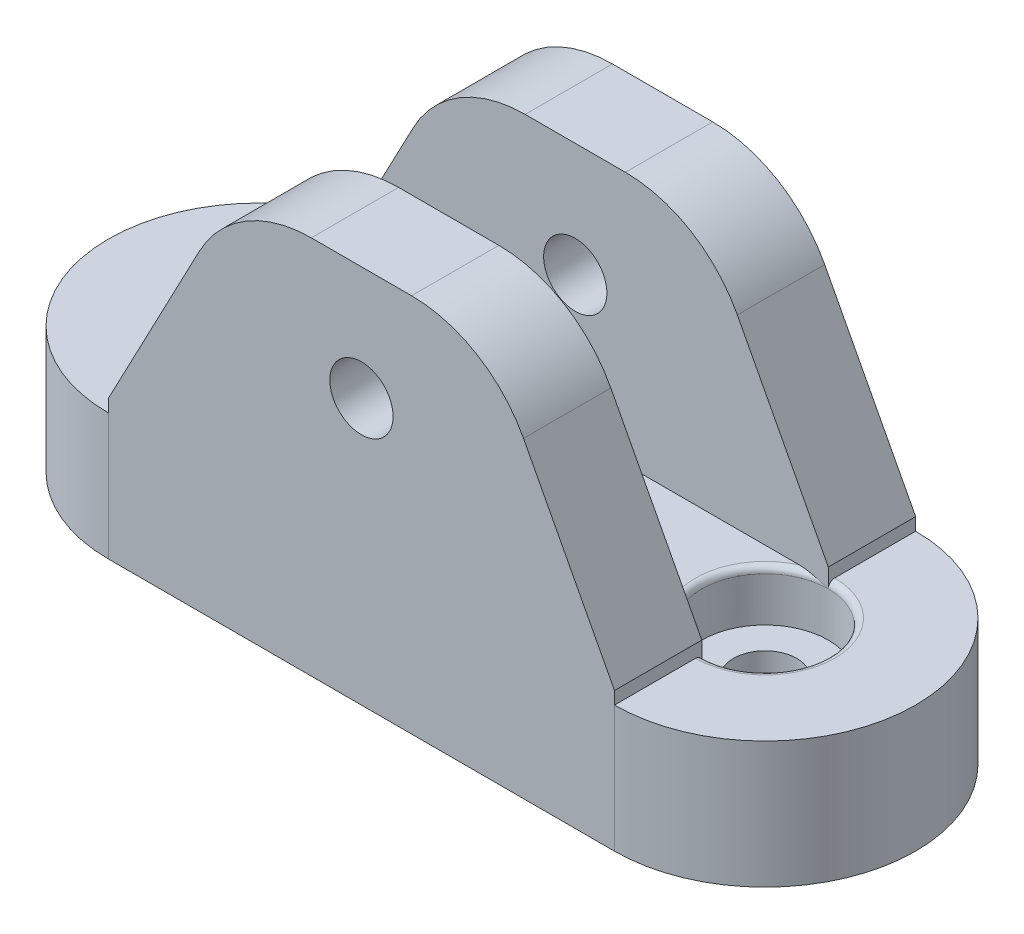
ISO-10303-21;
HEADER;
FILE_DESCRIPTION(('STEP AP214'),'2;1');
FILE_NAME('part.step','',(''),(''),'','','');
FILE_SCHEMA(('AUTOMOTIVE_DESIGN { 1 0 10303 214 1 1 1 1 }'));
ENDSEC;
DATA;
#1=APPLICATION_CONTEXT('core data for automotive mechanical design processes');
#2=APPLICATION_PROTOCOL_DEFINITION('international standard','automotive_design',2000,#1);
#3=PRODUCT_CONTEXT('',#1,'mechanical');
#4=PRODUCT('Part','Part','',(#3));
#5=PRODUCT_RELATED_PRODUCT_CATEGORY('part','',(#4));
#6=PRODUCT_DEFINITION_FORMATION('','',#4);
#7=PRODUCT_DEFINITION_CONTEXT('part definition',#1,'design');
#8=PRODUCT_DEFINITION('design','',#6,#7);
#9=PRODUCT_DEFINITION_SHAPE('','',#8);
#10=(LENGTH_UNIT() NAMED_UNIT(*) SI_UNIT(.MILLI.,.METRE.));
#11=(NAMED_UNIT(*) PLANE_ANGLE_UNIT() SI_UNIT($,.RADIAN.));
#12=(NAMED_UNIT(*) SI_UNIT($,.STERADIAN.) SOLID_ANGLE_UNIT());
#13=UNCERTAINTY_MEASURE_WITH_UNIT(LENGTH_MEASURE(1.E-05),#10,'distance_accuracy_value','');
#14=(GEOMETRIC_REPRESENTATION_CONTEXT(3) GLOBAL_UNCERTAINTY_ASSIGNED_CONTEXT((#13)) GLOBAL_UNIT_ASSIGNED_CONTEXT((#10,
#11,#12)) REPRESENTATION_CONTEXT('',''));
#15=CARTESIAN_POINT('',(0.,0.,0.));
#16=DIRECTION('',(0.,0.,1.));
#17=DIRECTION('',(1.,0.,0.));
#18=AXIS2_PLACEMENT_3D('',#15,#16,#17);
#19=CARTESIAN_POINT('',(-40.,9.5,0.));
#20=DIRECTION('',(0.,1.,0.));
#21=DIRECTION('',(0.,0.,1.));
#22=AXIS2_PLACEMENT_3D('',#19,#20,#21);
#23=TOROIDAL_SURFACE('',#22,5.5,0.5);
#24=CARTESIAN_POINT('',(-40.,9.5,5.5));
#25=DIRECTION('',(-1.,0.,0.));
#26=DIRECTION('',(0.,0.,1.));
#27=AXIS2_PLACEMENT_3D('',#24,#25,#26);
#28=CIRCLE('',#27,0.5);
#29=CARTESIAN_POINT('',(-40.,9.50000261258141,5.));
#30=VERTEX_POINT('',#29);
#31=CARTESIAN_POINT('',(-40.,10.,5.5));
#32=VERTEX_POINT('',#31);
#33=EDGE_CURVE('E114',#30,#32,#28,.F.);
#34=ORIENTED_EDGE('',*,*,#33,.F.);
#35=CARTESIAN_POINT('',(-40.,9.5,0.));
#36=DIRECTION('',(0.,1.,0.));
#37=DIRECTION('',(0.,0.,1.));
#38=AXIS2_PLACEMENT_3D('',#35,#36,#37);
#39=CIRCLE('',#38,5.);
#40=CARTESIAN_POINT('',(-40.,9.50000261332683,-5.));
#41=VERTEX_POINT('',#40);
#42=EDGE_CURVE('E511',#41,#30,#39,.T.);
#43=ORIENTED_EDGE('',*,*,#42,.F.);
#44=CARTESIAN_POINT('',(-40.,9.5,-5.49999999999999));
#45=DIRECTION('',(-1.,0.,0.));
#46=DIRECTION('',(0.,0.,1.));
#47=AXIS2_PLACEMENT_3D('',#44,#45,#46);
#48=CIRCLE('',#47,0.5);
#49=CARTESIAN_POINT('',(-40.,10.,-5.49999999999999));
#50=VERTEX_POINT('',#49);
#51=EDGE_CURVE('E12',#50,#41,#48,.F.);
#52=ORIENTED_EDGE('',*,*,#51,.F.);
#53=CARTESIAN_POINT('',(-40.,10.,0.));
#54=DIRECTION('',(0.,1.,0.));
#55=DIRECTION('',(0.,0.,1.));
#56=AXIS2_PLACEMENT_3D('',#53,#54,#55);
#57=CIRCLE('',#56,5.5);
#58=EDGE_CURVE('E524',#32,#50,#57,.F.);
#59=ORIENTED_EDGE('',*,*,#58,.F.);
#60=EDGE_LOOP('',(#34,#43,#52,#59));
#61=FACE_BOUND('',#60,.T.);
#62=ADVANCED_FACE('F104',(#61),#23,.T.);
#63=CARTESIAN_POINT('',(0.,9.5,0.));
#64=DIRECTION('',(0.,1.,0.));
#65=DIRECTION('',(0.,0.,1.));
#66=AXIS2_PLACEMENT_3D('',#63,#64,#65);
#67=TOROIDAL_SURFACE('',#66,5.5,0.5);
#68=CARTESIAN_POINT('',(-2.29128784747791,10.,5.));
#69=CARTESIAN_POINT('',(-2.2490483743288,9.99999410904903,5.));
#70=CARTESIAN_POINT('',(-2.20681979969826,9.9990718362252,5.));
#71=CARTESIAN_POINT('',(-2.12244384316885,9.99559960665418,5.));
#72=CARTESIAN_POINT('',(-2.08029643715897,9.99305024742337,5.));
#73=CARTESIAN_POINT('',(-1.95415157812684,9.9832781161519,5.));
#74=CARTESIAN_POINT('',(-1.87031771096238,9.97392997135818,5.));
#75=CARTESIAN_POINT('',(-1.70358415770108,9.95083147326194,5.));
#76=CARTESIAN_POINT('',(-1.62068223483208,9.93709656666971,5.));
#77=CARTESIAN_POINT('',(-1.45551091644458,9.90613848742699,5.));
#78=CARTESIAN_POINT('',(-1.37324175258213,9.88891409498158,5.));
#79=CARTESIAN_POINT('',(-1.2243526500402,9.85513702582717,5.));
#80=CARTESIAN_POINT('',(-1.15762775147923,9.8390397070518,5.));
#81=CARTESIAN_POINT('',(-0.929403539405844,9.78131038986787,5.));
#82=CARTESIAN_POINT('',(-0.768819442296111,9.73608054179532,5.));
#83=CARTESIAN_POINT('',(-0.448992904347548,9.64114954774573,5.));
#84=CARTESIAN_POINT('',(-0.289750807280321,9.59144729202464,5.));
#85=CARTESIAN_POINT('',(-0.0915925992896696,9.52895998544529,5.));
#86=CARTESIAN_POINT('',(-0.0525378271088201,9.51661349275646,5.));
#87=CARTESIAN_POINT('',(-0.00898933106001763,9.50284267768611,5.));
#88=CARTESIAN_POINT('',(-0.00449466526113658,9.50142133973301,5.));
#89=CARTESIAN_POINT('',(0.,9.5,5.));
#90=B_SPLINE_CURVE_WITH_KNOTS('',3,(#68,#69,#70,#71,#72,#73,#74,#75,#76,#77,#78,#79,#80,#81,#82,
#83,#84,#85,#86,#87,#88,#89),.UNSPECIFIED.,.F.,.F.,(4,2,2,2,2,2,2,2,2,2,4),(0.,
0.126691793541781,0.253337088693143,0.506227274035632,0.758236619482897,1.01033421053244,
1.21623290454849,1.71656005335375,2.21701169310375,2.33989131447064,2.35403345009444),.UNSPECIFIED.);
#91=CARTESIAN_POINT('',(0.,9.50000261308246,5.));
#92=VERTEX_POINT('',#91);
#93=CARTESIAN_POINT('',(-2.29128784747791,10.,5.));
#94=VERTEX_POINT('',#93);
#95=EDGE_CURVE('E128',#92,#94,#90,.F.);
#96=ORIENTED_EDGE('',*,*,#95,.F.);
#97=CARTESIAN_POINT('',(0.,9.5,0.));
#98=DIRECTION('',(0.,1.,0.));
#99=DIRECTION('',(0.,0.,1.));
#100=AXIS2_PLACEMENT_3D('',#97,#98,#99);
#101=CIRCLE('',#100,5.);
#102=CARTESIAN_POINT('',(0.,9.50000174205497,-5.));
#103=VERTEX_POINT('',#102);
#104=EDGE_CURVE('E493',#103,#92,#101,.T.);
#105=ORIENTED_EDGE('',*,*,#104,.F.);
#106=CARTESIAN_POINT('',(-2.29128784747791,10.,-5.));
#107=CARTESIAN_POINT('',(-2.2490483743288,9.99999410904903,-5.));
#108=CARTESIAN_POINT('',(-2.20681979969826,9.9990718362252,-5.));
#109=CARTESIAN_POINT('',(-2.12244384316885,9.99559960665418,-5.));
#110=CARTESIAN_POINT('',(-2.08029643715897,9.99305024742337,-5.));
#111=CARTESIAN_POINT('',(-1.95415157812684,9.9832781161519,-5.));
#112=CARTESIAN_POINT('',(-1.87031771096238,9.97392997135818,-5.));
#113=CARTESIAN_POINT('',(-1.70358415770108,9.95083147326194,-5.));
#114=CARTESIAN_POINT('',(-1.62068223483208,9.93709656666971,-5.));
#115=CARTESIAN_POINT('',(-1.45551091644458,9.90613848742699,-5.));
#116=CARTESIAN_POINT('',(-1.37324175258213,9.88891409498158,-5.));
#117=CARTESIAN_POINT('',(-1.2243526500402,9.85513702582717,-5.));
#118=CARTESIAN_POINT('',(-1.15762775147923,9.8390397070518,-5.));
#119=CARTESIAN_POINT('',(-0.929403539405845,9.78131038986787,-5.));
#120=CARTESIAN_POINT('',(-0.768819442296111,9.73608054179532,-5.));
#121=CARTESIAN_POINT('',(-0.448992904347548,9.64114954774573,-5.));
#122=CARTESIAN_POINT('',(-0.289750807280322,9.59144729202464,-4.99999999999999));
#123=CARTESIAN_POINT('',(-0.0915925992896701,9.52895998544529,-5.));
#124=CARTESIAN_POINT('',(-0.0525378271088203,9.51661349275646,-5.));
#125=CARTESIAN_POINT('',(-0.00898933106001771,9.50284267768611,-5.));
#126=CARTESIAN_POINT('',(-0.00449466526113663,9.50142133973301,-5.));
#127=CARTESIAN_POINT('',(0.,9.5,-5.));
#128=B_SPLINE_CURVE_WITH_KNOTS('',3,(#106,#107,#108,#109,#110,#111,#112,#113,#114,#115,#116,
#117,#118,#119,#120,#121,#122,#123,#124,#125,#126,#127),.UNSPECIFIED.,.F.,.F.,(4,2,2,2,2,2,2,2,
2,2,4),(0.,0.126691793541781,0.253337088693143,0.506227274035632,0.758236619482896,
1.01033421053244,1.21623290454848,1.71656005335375,2.21701169310375,2.33989131447064,
2.35403345009444),.UNSPECIFIED.);
#129=CARTESIAN_POINT('',(-2.29128784747791,10.,-5.));
#130=VERTEX_POINT('',#129);
#131=EDGE_CURVE('E527',#130,#103,#128,.T.);
#132=ORIENTED_EDGE('',*,*,#131,.F.);
#133=CARTESIAN_POINT('',(0.,10.,0.));
#134=DIRECTION('',(0.,1.,0.));
#135=DIRECTION('',(0.,0.,1.));
#136=AXIS2_PLACEMENT_3D('',#133,#134,#135);
#137=CIRCLE('',#136,5.5);
#138=EDGE_CURVE('E516',#94,#130,#137,.F.);
#139=ORIENTED_EDGE('',*,*,#138,.F.);
#140=EDGE_LOOP('',(#96,#105,#132,#139));
#141=FACE_BOUND('',#140,.T.);
#142=ADVANCED_FACE('F643',(#141),#67,.T.);
#143=CARTESIAN_POINT('',(0.,10.,0.));
#144=DIRECTION('',(0.,1.,0.));
#145=DIRECTION('',(0.,0.,1.));
#146=AXIS2_PLACEMENT_3D('',#143,#144,#145);
#147=PLANE('',#146);
#148=DIRECTION('',(1.,0.,0.));
#149=VECTOR('',#148,1.);
#150=CARTESIAN_POINT('',(0.,10.,-5.));
#151=LINE('',#150,#149);
#152=CARTESIAN_POINT('',(-37.7087121525221,10.,-5.));
#153=VERTEX_POINT('',#152);
#154=EDGE_CURVE('E351',#153,#130,#151,.T.);
#155=ORIENTED_EDGE('',*,*,#154,.F.);
#156=CARTESIAN_POINT('',(-40.,10.,0.));
#157=DIRECTION('',(0.,1.,0.));
#158=DIRECTION('',(0.,0.,1.));
#159=AXIS2_PLACEMENT_3D('',#156,#157,#158);
#160=CIRCLE('',#159,5.5);
#161=CARTESIAN_POINT('',(-37.7087121525221,10.,5.));
#162=VERTEX_POINT('',#161);
#163=EDGE_CURVE('E520',#153,#162,#160,.F.);
#164=ORIENTED_EDGE('',*,*,#163,.T.);
#165=DIRECTION('',(1.,0.,0.));
#166=VECTOR('',#165,1.);
#167=CARTESIAN_POINT('',(0.,10.,5.));
#168=LINE('',#167,#166);
#169=EDGE_CURVE('E444',#162,#94,#168,.T.);
#170=ORIENTED_EDGE('',*,*,#169,.T.);
#171=ORIENTED_EDGE('',*,*,#138,.T.);
#172=EDGE_LOOP('',(#155,#164,#170,#171));
#173=FACE_BOUND('',#172,.T.);
#174=ADVANCED_FACE('F625',(#173),#147,.T.);
#175=DIRECTION('',(0.,0.,-1.));
#176=VECTOR('',#175,1.);
#177=CARTESIAN_POINT('',(0.,10.,0.));
#178=LINE('',#177,#176);
#179=CARTESIAN_POINT('',(0.,10.,-5.5));
#180=VERTEX_POINT('',#179);
#181=CARTESIAN_POINT('',(0.,10.,-11.9));
#182=VERTEX_POINT('',#181);
#183=EDGE_CURVE('E348',#180,#182,#178,.T.);
#184=ORIENTED_EDGE('',*,*,#183,.F.);
#185=CARTESIAN_POINT('',(0.,10.,0.));
#186=DIRECTION('',(0.,1.,0.));
#187=DIRECTION('',(0.,0.,1.));
#188=AXIS2_PLACEMENT_3D('',#185,#186,#187);
#189=CIRCLE('',#188,5.5);
#190=CARTESIAN_POINT('',(0.,10.,5.5));
#191=VERTEX_POINT('',#190);
#192=EDGE_CURVE('E507',#180,#191,#189,.F.);
#193=ORIENTED_EDGE('',*,*,#192,.T.);
#194=DIRECTION('',(0.,0.,-1.));
#195=VECTOR('',#194,1.);
#196=CARTESIAN_POINT('',(0.,10.,0.));
#197=LINE('',#196,#195);
#198=CARTESIAN_POINT('',(0.,10.,11.9));
#199=VERTEX_POINT('',#198);
#200=EDGE_CURVE('E440',#199,#191,#197,.T.);
#201=ORIENTED_EDGE('',*,*,#200,.F.);
#202=CARTESIAN_POINT('',(0.,10.,0.));
#203=DIRECTION('',(0.,1.,0.));
#204=DIRECTION('',(0.,0.,1.));
#205=AXIS2_PLACEMENT_3D('',#202,#203,#204);
#206=CIRCLE('',#205,11.9);
#207=EDGE_CURVE('E457',#199,#182,#206,.T.);
#208=ORIENTED_EDGE('',*,*,#207,.T.);
#209=EDGE_LOOP('',(#184,#193,#201,#208));
#210=FACE_BOUND('',#209,.T.);
#211=ADVANCED_FACE('F619',(#210),#147,.T.);
#212=CARTESIAN_POINT('',(-40.,10.,0.));
#213=DIRECTION('',(0.,-1.,0.));
#214=DIRECTION('',(0.,0.,-1.));
#215=AXIS2_PLACEMENT_3D('',#212,#213,#214);
#216=CYLINDRICAL_SURFACE('',#215,2.49999999999999);
#217=CARTESIAN_POINT('',(-40.,0.,0.));
#218=DIRECTION('',(0.,1.,0.));
#219=DIRECTION('',(0.,0.,1.));
#220=AXIS2_PLACEMENT_3D('',#217,#218,#219);
#221=CIRCLE('',#220,2.49999999999999);
#222=CARTESIAN_POINT('',(-40.,0.,2.5));
#223=VERTEX_POINT('',#222);
#224=EDGE_CURVE('E452',#223,#223,#221,.T.);
#225=ORIENTED_EDGE('',*,*,#224,.F.);
#226=EDGE_LOOP('',(#225));
#227=FACE_BOUND('',#226,.T.);
#228=CARTESIAN_POINT('',(-40.,6.,0.));
#229=DIRECTION('',(0.,1.,0.));
#230=DIRECTION('',(0.,0.,1.));
#231=AXIS2_PLACEMENT_3D('',#228,#229,#230);
#232=CIRCLE('',#231,2.49999999999999);
#233=CARTESIAN_POINT('',(-40.,6.,2.5));
#234=VERTEX_POINT('',#233);
#235=EDGE_CURVE('E498',#234,#234,#232,.T.);
#236=ORIENTED_EDGE('',*,*,#235,.T.);
#237=EDGE_LOOP('',(#236));
#238=FACE_BOUND('',#237,.T.);
#239=ADVANCED_FACE('F615',(#227,#238),#216,.F.);
#240=DIRECTION('',(0.,0.,1.));
#241=VECTOR('',#240,1.);
#242=CARTESIAN_POINT('',(-40.,10.,0.));
#243=LINE('',#242,#241);
#244=CARTESIAN_POINT('',(-40.,10.,11.9));
#245=VERTEX_POINT('',#244);
#246=EDGE_CURVE('E421',#32,#245,#243,.T.);
#247=ORIENTED_EDGE('',*,*,#246,.F.);
#248=ORIENTED_EDGE('',*,*,#58,.T.);
#249=DIRECTION('',(0.,0.,1.));
#250=VECTOR('',#249,1.);
#251=CARTESIAN_POINT('',(-40.,10.,0.));
#252=LINE('',#251,#250);
#253=CARTESIAN_POINT('',(-40.,10.,-11.9));
#254=VERTEX_POINT('',#253);
#255=EDGE_CURVE('E331',#254,#50,#252,.T.);
#256=ORIENTED_EDGE('',*,*,#255,.F.);
#257=CARTESIAN_POINT('',(-40.,10.,0.));
#258=DIRECTION('',(0.,1.,0.));
#259=DIRECTION('',(0.,0.,1.));
#260=AXIS2_PLACEMENT_3D('',#257,#258,#259);
#261=CIRCLE('',#260,11.9);
#262=EDGE_CURVE('E461',#254,#245,#261,.T.);
#263=ORIENTED_EDGE('',*,*,#262,.T.);
#264=EDGE_LOOP('',(#247,#248,#256,#263));
#265=FACE_BOUND('',#264,.T.);
#266=ADVANCED_FACE('F618',(#265),#147,.T.);
#267=CARTESIAN_POINT('',(0.,0.,0.));
#268=DIRECTION('',(0.,1.,0.));
#269=DIRECTION('',(0.,0.,1.));
#270=AXIS2_PLACEMENT_3D('',#267,#268,#269);
#271=PLANE('',#270);
#272=DIRECTION('',(-1.,0.,0.));
#273=VECTOR('',#272,1.);
#274=CARTESIAN_POINT('',(0.,0.,-11.9));
#275=LINE('',#274,#273);
#276=CARTESIAN_POINT('',(0.,0.,-11.9));
#277=VERTEX_POINT('',#276);
#278=CARTESIAN_POINT('',(-40.,0.,-11.9));
#279=VERTEX_POINT('',#278);
#280=EDGE_CURVE('E470',#277,#279,#275,.T.);
#281=ORIENTED_EDGE('',*,*,#280,.F.);
#282=CARTESIAN_POINT('',(0.,0.,0.));
#283=DIRECTION('',(0.,1.,0.));
#284=DIRECTION('',(0.,0.,1.));
#285=AXIS2_PLACEMENT_3D('',#282,#283,#284);
#286=CIRCLE('',#285,11.9);
#287=CARTESIAN_POINT('',(0.,0.,11.9));
#288=VERTEX_POINT('',#287);
#289=EDGE_CURVE('E456',#288,#277,#286,.T.);
#290=ORIENTED_EDGE('',*,*,#289,.F.);
#291=DIRECTION('',(1.,0.,0.));
#292=VECTOR('',#291,1.);
#293=CARTESIAN_POINT('',(0.,0.,11.9));
#294=LINE('',#293,#292);
#295=CARTESIAN_POINT('',(-40.,0.,11.9));
#296=VERTEX_POINT('',#295);
#297=EDGE_CURVE('E462',#296,#288,#294,.T.);
#298=ORIENTED_EDGE('',*,*,#297,.F.);
#299=CARTESIAN_POINT('',(-40.,0.,0.));
#300=DIRECTION('',(0.,1.,0.));
#301=DIRECTION('',(0.,0.,1.));
#302=AXIS2_PLACEMENT_3D('',#299,#300,#301);
#303=CIRCLE('',#302,11.9);
#304=EDGE_CURVE('E473',#279,#296,#303,.T.);
#305=ORIENTED_EDGE('',*,*,#304,.F.);
#306=EDGE_LOOP('',(#281,#290,#298,#305));
#307=FACE_BOUND('',#306,.T.);
#308=ORIENTED_EDGE('',*,*,#224,.T.);
#309=EDGE_LOOP('',(#308));
#310=FACE_BOUND('',#309,.T.);
#311=CARTESIAN_POINT('',(0.,0.,0.));
#312=DIRECTION('',(0.,1.,0.));
#313=DIRECTION('',(0.,0.,-1.));
#314=AXIS2_PLACEMENT_3D('',#311,#312,#313);
#315=CIRCLE('',#314,2.5);
#316=CARTESIAN_POINT('',(0.,0.,-2.5));
#317=VERTEX_POINT('',#316);
#318=EDGE_CURVE('E448',#317,#317,#315,.T.);
#319=ORIENTED_EDGE('',*,*,#318,.T.);
#320=EDGE_LOOP('',(#319));
#321=FACE_BOUND('',#320,.T.);
#322=ADVANCED_FACE('F623',(#307,#310,#321),#271,.F.);
#323=CARTESIAN_POINT('',(0.,10.,0.));
#324=DIRECTION('',(0.,-1.,0.));
#325=DIRECTION('',(0.,0.,-1.));
#326=AXIS2_PLACEMENT_3D('',#323,#324,#325);
#327=CYLINDRICAL_SURFACE('',#326,11.9);
#328=ORIENTED_EDGE('',*,*,#289,.T.);
#329=DIRECTION('',(0.,-1.,0.));
#330=VECTOR('',#329,1.);
#331=CARTESIAN_POINT('',(0.,10.,-11.9));
#332=LINE('',#331,#330);
#333=EDGE_CURVE('E489',#182,#277,#332,.T.);
#334=ORIENTED_EDGE('',*,*,#333,.F.);
#335=ORIENTED_EDGE('',*,*,#207,.F.);
#336=DIRECTION('',(0.,-1.,0.));
#337=VECTOR('',#336,1.);
#338=CARTESIAN_POINT('',(0.,10.,11.9));
#339=LINE('',#338,#337);
#340=EDGE_CURVE('E466',#199,#288,#339,.T.);
#341=ORIENTED_EDGE('',*,*,#340,.T.);
#342=EDGE_LOOP('',(#328,#334,#335,#341));
#343=FACE_BOUND('',#342,.T.);
#344=ADVANCED_FACE('F628',(#343),#327,.T.);
#345=CARTESIAN_POINT('',(0.,10.,-11.9));
#346=DIRECTION('',(0.,0.,1.));
#347=DIRECTION('',(1.,0.,0.));
#348=AXIS2_PLACEMENT_3D('',#345,#346,#347);
#349=PLANE('',#348);
#350=ORIENTED_EDGE('',*,*,#280,.T.);
#351=DIRECTION('',(0.,-1.,0.));
#352=VECTOR('',#351,1.);
#353=CARTESIAN_POINT('',(-40.,10.,-11.9));
#354=LINE('',#353,#352);
#355=EDGE_CURVE('E485',#254,#279,#354,.T.);
#356=ORIENTED_EDGE('',*,*,#355,.F.);
#357=DIRECTION('',(0.,1.,0.));
#358=VECTOR('',#357,1.);
#359=CARTESIAN_POINT('',(-40.,10.,-11.9));
#360=LINE('',#359,#358);
#361=CARTESIAN_POINT('',(-40.,11.,-11.9));
#362=VERTEX_POINT('',#361);
#363=EDGE_CURVE('E300',#254,#362,#360,.T.);
#364=ORIENTED_EDGE('',*,*,#363,.T.);
#365=DIRECTION('',(-0.465746432832622,-0.884918222381983,0.));
#366=VECTOR('',#365,1.);
#367=CARTESIAN_POINT('',(-32.8118608798283,24.6574643283262,-11.9));
#368=LINE('',#367,#366);
#369=CARTESIAN_POINT('',(-32.8118608798283,24.6574643283262,-11.9));
#370=VERTEX_POINT('',#369);
#371=EDGE_CURVE('E296',#370,#362,#368,.T.);
#372=ORIENTED_EDGE('',*,*,#371,.F.);
#373=CARTESIAN_POINT('',(-23.9626786560085,20.,-11.9));
#374=DIRECTION('',(0.,0.,1.));
#375=DIRECTION('',(1.,0.,0.));
#376=AXIS2_PLACEMENT_3D('',#373,#374,#375);
#377=CIRCLE('',#376,10.);
#378=CARTESIAN_POINT('',(-23.9626786560085,30.,-11.9));
#379=VERTEX_POINT('',#378);
#380=EDGE_CURVE('E277',#379,#370,#377,.T.);
#381=ORIENTED_EDGE('',*,*,#380,.F.);
#382=DIRECTION('',(-1.,0.,0.));
#383=VECTOR('',#382,1.);
#384=CARTESIAN_POINT('',(-16.0373213439915,30.,-11.9));
#385=LINE('',#384,#383);
#386=CARTESIAN_POINT('',(-16.0373213439915,30.,-11.9));
#387=VERTEX_POINT('',#386);
#388=EDGE_CURVE('E257',#387,#379,#385,.T.);
#389=ORIENTED_EDGE('',*,*,#388,.F.);
#390=CARTESIAN_POINT('',(-16.0373213439915,20.,-11.9));
#391=DIRECTION('',(0.,0.,1.));
#392=DIRECTION('',(1.,0.,0.));
#393=AXIS2_PLACEMENT_3D('',#390,#391,#392);
#394=CIRCLE('',#393,10.);
#395=CARTESIAN_POINT('',(-7.18813912017169,24.6574643283262,-11.9));
#396=VERTEX_POINT('',#395);
#397=EDGE_CURVE('E274',#396,#387,#394,.T.);
#398=ORIENTED_EDGE('',*,*,#397,.F.);
#399=DIRECTION('',(0.465746432832622,-0.884918222381983,0.));
#400=VECTOR('',#399,1.);
#401=CARTESIAN_POINT('',(-7.18813912017169,24.6574643283262,-11.9));
#402=LINE('',#401,#400);
#403=CARTESIAN_POINT('',(0.,11.,-11.9));
#404=VERTEX_POINT('',#403);
#405=EDGE_CURVE('E266',#396,#404,#402,.T.);
#406=ORIENTED_EDGE('',*,*,#405,.T.);
#407=DIRECTION('',(0.,-1.,0.));
#408=VECTOR('',#407,1.);
#409=CARTESIAN_POINT('',(0.,10.,-11.9));
#410=LINE('',#409,#408);
#411=EDGE_CURVE('E303',#404,#182,#410,.T.);
#412=ORIENTED_EDGE('',*,*,#411,.T.);
#413=ORIENTED_EDGE('',*,*,#333,.T.);
#414=EDGE_LOOP('',(#350,#356,#364,#372,#381,#389,#398,#406,#412,#413));
#415=FACE_BOUND('',#414,.T.);
#416=CARTESIAN_POINT('',(-20.,21.,-11.9));
#417=DIRECTION('',(0.,0.,1.));
#418=DIRECTION('',(1.,0.,0.));
#419=AXIS2_PLACEMENT_3D('',#416,#417,#418);
#420=CIRCLE('',#419,2.5);
#421=CARTESIAN_POINT('',(-17.5,21.,-11.9));
#422=VERTEX_POINT('',#421);
#423=EDGE_CURVE('E312',#422,#422,#420,.T.);
#424=ORIENTED_EDGE('',*,*,#423,.T.);
#425=EDGE_LOOP('',(#424));
#426=FACE_BOUND('',#425,.T.);
#427=ADVANCED_FACE('F271',(#415,#426),#349,.F.);
#428=CARTESIAN_POINT('',(-40.,10.,0.));
#429=DIRECTION('',(0.,-1.,0.));
#430=DIRECTION('',(0.,0.,-1.));
#431=AXIS2_PLACEMENT_3D('',#428,#429,#430);
#432=CYLINDRICAL_SURFACE('',#431,11.9);
#433=ORIENTED_EDGE('',*,*,#304,.T.);
#434=DIRECTION('',(0.,-1.,0.));
#435=VECTOR('',#434,1.);
#436=CARTESIAN_POINT('',(-40.,10.,11.9));
#437=LINE('',#436,#435);
#438=EDGE_CURVE('E481',#245,#296,#437,.T.);
#439=ORIENTED_EDGE('',*,*,#438,.F.);
#440=ORIENTED_EDGE('',*,*,#262,.F.);
#441=ORIENTED_EDGE('',*,*,#355,.T.);
#442=EDGE_LOOP('',(#433,#439,#440,#441));
#443=FACE_BOUND('',#442,.T.);
#444=ADVANCED_FACE('F632',(#443),#432,.T.);
#445=CARTESIAN_POINT('',(0.,10.,11.9));
#446=DIRECTION('',(0.,0.,-1.));
#447=DIRECTION('',(-1.,0.,0.));
#448=AXIS2_PLACEMENT_3D('',#445,#446,#447);
#449=PLANE('',#448);
#450=ORIENTED_EDGE('',*,*,#297,.T.);
#451=ORIENTED_EDGE('',*,*,#340,.F.);
#452=DIRECTION('',(0.,1.,0.));
#453=VECTOR('',#452,1.);
#454=CARTESIAN_POINT('',(0.,10.,11.9));
#455=LINE('',#454,#453);
#456=CARTESIAN_POINT('',(0.,11.,11.9));
#457=VERTEX_POINT('',#456);
#458=EDGE_CURVE('E412',#199,#457,#455,.T.);
#459=ORIENTED_EDGE('',*,*,#458,.T.);
#460=DIRECTION('',(0.465746432832622,-0.884918222381983,0.));
#461=VECTOR('',#460,1.);
#462=CARTESIAN_POINT('',(-7.18813912017169,24.6574643283262,11.9));
#463=LINE('',#462,#461);
#464=CARTESIAN_POINT('',(-7.18813912017169,24.6574643283262,11.9));
#465=VERTEX_POINT('',#464);
#466=EDGE_CURVE('E369',#465,#457,#463,.T.);
#467=ORIENTED_EDGE('',*,*,#466,.F.);
#468=CARTESIAN_POINT('',(-16.0373213439915,20.,11.9));
#469=DIRECTION('',(0.,0.,1.));
#470=DIRECTION('',(1.,0.,0.));
#471=AXIS2_PLACEMENT_3D('',#468,#469,#470);
#472=CIRCLE('',#471,10.);
#473=CARTESIAN_POINT('',(-16.0373213439915,30.,11.9));
#474=VERTEX_POINT('',#473);
#475=EDGE_CURVE('E360',#465,#474,#472,.T.);
#476=ORIENTED_EDGE('',*,*,#475,.T.);
#477=DIRECTION('',(-1.,0.,0.));
#478=VECTOR('',#477,1.);
#479=CARTESIAN_POINT('',(-16.0373213439915,30.,11.9));
#480=LINE('',#479,#478);
#481=CARTESIAN_POINT('',(-23.9626786560085,30.,11.9));
#482=VERTEX_POINT('',#481);
#483=EDGE_CURVE('E396',#474,#482,#480,.T.);
#484=ORIENTED_EDGE('',*,*,#483,.T.);
#485=CARTESIAN_POINT('',(-23.9626786560085,20.,11.9));
#486=DIRECTION('',(0.,0.,1.));
#487=DIRECTION('',(1.,0.,0.));
#488=AXIS2_PLACEMENT_3D('',#485,#486,#487);
#489=CIRCLE('',#488,10.);
#490=CARTESIAN_POINT('',(-32.8118608798283,24.6574643283262,11.9));
#491=VERTEX_POINT('',#490);
#492=EDGE_CURVE('E400',#482,#491,#489,.T.);
#493=ORIENTED_EDGE('',*,*,#492,.T.);
#494=DIRECTION('',(-0.465746432832622,-0.884918222381983,0.));
#495=VECTOR('',#494,1.);
#496=CARTESIAN_POINT('',(-32.8118608798283,24.6574643283262,11.9));
#497=LINE('',#496,#495);
#498=CARTESIAN_POINT('',(-40.,11.,11.9));
#499=VERTEX_POINT('',#498);
#500=EDGE_CURVE('E404',#491,#499,#497,.T.);
#501=ORIENTED_EDGE('',*,*,#500,.T.);
#502=DIRECTION('',(0.,-1.,0.));
#503=VECTOR('',#502,1.);
#504=CARTESIAN_POINT('',(-40.,10.,11.9));
#505=LINE('',#504,#503);
#506=EDGE_CURVE('E408',#499,#245,#505,.T.);
#507=ORIENTED_EDGE('',*,*,#506,.T.);
#508=ORIENTED_EDGE('',*,*,#438,.T.);
#509=EDGE_LOOP('',(#450,#451,#459,#467,#476,#484,#493,#501,#507,#508));
#510=FACE_BOUND('',#509,.T.);
#511=CARTESIAN_POINT('',(-20.,21.,11.9));
#512=DIRECTION('',(0.,0.,1.));
#513=DIRECTION('',(1.,0.,0.));
#514=AXIS2_PLACEMENT_3D('',#511,#512,#513);
#515=CIRCLE('',#514,2.5);
#516=CARTESIAN_POINT('',(-17.5,21.,11.9));
#517=VERTEX_POINT('',#516);
#518=EDGE_CURVE('E355',#517,#517,#515,.T.);
#519=ORIENTED_EDGE('',*,*,#518,.F.);
#520=EDGE_LOOP('',(#519));
#521=FACE_BOUND('',#520,.T.);
#522=ADVANCED_FACE('F613',(#510,#521),#449,.F.);
#523=CARTESIAN_POINT('',(0.,10.,0.));
#524=DIRECTION('',(0.,-1.,0.));
#525=DIRECTION('',(0.,0.,-1.));
#526=AXIS2_PLACEMENT_3D('',#523,#524,#525);
#527=CYLINDRICAL_SURFACE('',#526,2.5);
#528=CARTESIAN_POINT('',(0.,6.,0.));
#529=DIRECTION('',(0.,-1.,0.));
#530=DIRECTION('',(0.,0.,-1.));
#531=AXIS2_PLACEMENT_3D('',#528,#529,#530);
#532=CIRCLE('',#531,2.5);
#533=CARTESIAN_POINT('',(0.,6.,-2.5));
#534=VERTEX_POINT('',#533);
#535=EDGE_CURVE('E494',#534,#534,#532,.T.);
#536=ORIENTED_EDGE('',*,*,#535,.F.);
#537=EDGE_LOOP('',(#536));
#538=FACE_BOUND('',#537,.T.);
#539=ORIENTED_EDGE('',*,*,#318,.F.);
#540=EDGE_LOOP('',(#539));
#541=FACE_BOUND('',#540,.T.);
#542=ADVANCED_FACE('F609',(#538,#541),#527,.F.);
#543=CARTESIAN_POINT('',(-16.0373213439915,20.,5.));
#544=DIRECTION('',(0.,0.,1.));
#545=DIRECTION('',(1.,0.,0.));
#546=AXIS2_PLACEMENT_3D('',#543,#544,#545);
#547=CYLINDRICAL_SURFACE('',#546,10.);
#548=ORIENTED_EDGE('',*,*,#475,.F.);
#549=DIRECTION('',(0.,0.,1.));
#550=VECTOR('',#549,1.);
#551=CARTESIAN_POINT('',(-7.18813912017169,24.6574643283262,5.));
#552=LINE('',#551,#550);
#553=CARTESIAN_POINT('',(-7.18813912017169,24.6574643283262,5.));
#554=VERTEX_POINT('',#553);
#555=EDGE_CURVE('E418',#554,#465,#552,.T.);
#556=ORIENTED_EDGE('',*,*,#555,.F.);
#557=CARTESIAN_POINT('',(-16.0373213439915,20.,5.));
#558=DIRECTION('',(0.,0.,1.));
#559=DIRECTION('',(1.,0.,0.));
#560=AXIS2_PLACEMENT_3D('',#557,#558,#559);
#561=CIRCLE('',#560,10.);
#562=CARTESIAN_POINT('',(-16.0373213439915,30.,5.));
#563=VERTEX_POINT('',#562);
#564=EDGE_CURVE('E364',#554,#563,#561,.T.);
#565=ORIENTED_EDGE('',*,*,#564,.T.);
#566=DIRECTION('',(0.,0.,1.));
#567=VECTOR('',#566,1.);
#568=CARTESIAN_POINT('',(-16.0373213439915,30.,5.));
#569=LINE('',#568,#567);
#570=EDGE_CURVE('E392',#563,#474,#569,.T.);
#571=ORIENTED_EDGE('',*,*,#570,.T.);
#572=EDGE_LOOP('',(#548,#556,#565,#571));
#573=FACE_BOUND('',#572,.T.);
#574=ADVANCED_FACE('F587',(#573),#547,.T.);
#575=CARTESIAN_POINT('',(-7.18813912017169,24.6574643283262,5.));
#576=DIRECTION('',(-0.884918222381983,-0.465746432832622,0.));
#577=DIRECTION('',(0.465746432832622,-0.884918222381983,0.));
#578=AXIS2_PLACEMENT_3D('',#575,#576,#577);
#579=PLANE('',#578);
#580=ORIENTED_EDGE('',*,*,#466,.T.);
#581=DIRECTION('',(0.,0.,1.));
#582=VECTOR('',#581,1.);
#583=CARTESIAN_POINT('',(0.,11.,5.));
#584=LINE('',#583,#582);
#585=CARTESIAN_POINT('',(0.,11.,5.));
#586=VERTEX_POINT('',#585);
#587=EDGE_CURVE('E422',#586,#457,#584,.T.);
#588=ORIENTED_EDGE('',*,*,#587,.F.);
#589=DIRECTION('',(0.465746432832622,-0.884918222381983,0.));
#590=VECTOR('',#589,1.);
#591=CARTESIAN_POINT('',(-7.18813912017169,24.6574643283262,5.));
#592=LINE('',#591,#590);
#593=EDGE_CURVE('E388',#554,#586,#592,.T.);
#594=ORIENTED_EDGE('',*,*,#593,.F.);
#595=ORIENTED_EDGE('',*,*,#555,.T.);
#596=EDGE_LOOP('',(#580,#588,#594,#595));
#597=FACE_BOUND('',#596,.T.);
#598=ADVANCED_FACE('F582',(#597),#579,.F.);
#599=CARTESIAN_POINT('',(0.,10.,5.));
#600=DIRECTION('',(1.,0.,0.));
#601=DIRECTION('',(0.,0.,-1.));
#602=AXIS2_PLACEMENT_3D('',#599,#600,#601);
#603=PLANE('',#602);
#604=ORIENTED_EDGE('',*,*,#458,.F.);
#605=ORIENTED_EDGE('',*,*,#200,.T.);
#606=CARTESIAN_POINT('',(0.,9.5,5.5));
#607=DIRECTION('',(1.,0.,0.));
#608=DIRECTION('',(0.,0.,-1.));
#609=AXIS2_PLACEMENT_3D('',#606,#607,#608);
#610=CIRCLE('',#609,0.5);
#611=EDGE_CURVE('E672',#191,#92,#610,.F.);
#612=ORIENTED_EDGE('',*,*,#611,.T.);
#613=DIRECTION('',(0.,-1.,0.));
#614=VECTOR('',#613,1.);
#615=CARTESIAN_POINT('',(0.,10.,5.));
#616=LINE('',#615,#614);
#617=EDGE_CURVE('E384',#586,#92,#616,.T.);
#618=ORIENTED_EDGE('',*,*,#617,.F.);
#619=ORIENTED_EDGE('',*,*,#587,.T.);
#620=EDGE_LOOP('',(#604,#605,#612,#618,#619));
#621=FACE_BOUND('',#620,.T.);
#622=ADVANCED_FACE('F586',(#621),#603,.T.);
#623=CARTESIAN_POINT('',(-40.,10.,5.));
#624=DIRECTION('',(-1.,0.,0.));
#625=DIRECTION('',(0.,0.,1.));
#626=AXIS2_PLACEMENT_3D('',#623,#624,#625);
#627=PLANE('',#626);
#628=DIRECTION('',(0.,1.,0.));
#629=VECTOR('',#628,1.);
#630=CARTESIAN_POINT('',(-40.,10.,5.));
#631=LINE('',#630,#629);
#632=CARTESIAN_POINT('',(-40.,11.,5.));
#633=VERTEX_POINT('',#632);
#634=EDGE_CURVE('E381',#30,#633,#631,.T.);
#635=ORIENTED_EDGE('',*,*,#634,.F.);
#636=ORIENTED_EDGE('',*,*,#33,.T.);
#637=ORIENTED_EDGE('',*,*,#246,.T.);
#638=ORIENTED_EDGE('',*,*,#506,.F.);
#639=DIRECTION('',(0.,0.,1.));
#640=VECTOR('',#639,1.);
#641=CARTESIAN_POINT('',(-40.,11.,5.));
#642=LINE('',#641,#640);
#643=EDGE_CURVE('E426',#633,#499,#642,.T.);
#644=ORIENTED_EDGE('',*,*,#643,.F.);
#645=EDGE_LOOP('',(#635,#636,#637,#638,#644));
#646=FACE_BOUND('',#645,.T.);
#647=ADVANCED_FACE('F591',(#646),#627,.T.);
#648=CARTESIAN_POINT('',(-32.8118608798283,24.6574643283262,5.));
#649=DIRECTION('',(-0.884918222381983,0.465746432832622,0.));
#650=DIRECTION('',(-0.465746432832622,-0.884918222381983,0.));
#651=AXIS2_PLACEMENT_3D('',#648,#649,#650);
#652=PLANE('',#651);
#653=ORIENTED_EDGE('',*,*,#500,.F.);
#654=DIRECTION('',(0.,0.,1.));
#655=VECTOR('',#654,1.);
#656=CARTESIAN_POINT('',(-32.8118608798283,24.6574643283262,5.));
#657=LINE('',#656,#655);
#658=CARTESIAN_POINT('',(-32.8118608798283,24.6574643283262,5.));
#659=VERTEX_POINT('',#658);
#660=EDGE_CURVE('E430',#659,#491,#657,.T.);
#661=ORIENTED_EDGE('',*,*,#660,.F.);
#662=DIRECTION('',(-0.465746432832622,-0.884918222381983,0.));
#663=VECTOR('',#662,1.);
#664=CARTESIAN_POINT('',(-32.8118608798283,24.6574643283262,5.));
#665=LINE('',#664,#663);
#666=EDGE_CURVE('E377',#659,#633,#665,.T.);
#667=ORIENTED_EDGE('',*,*,#666,.T.);
#668=ORIENTED_EDGE('',*,*,#643,.T.);
#669=EDGE_LOOP('',(#653,#661,#667,#668));
#670=FACE_BOUND('',#669,.T.);
#671=ADVANCED_FACE('F595',(#670),#652,.T.);
#672=CARTESIAN_POINT('',(-23.9626786560085,20.,5.));
#673=DIRECTION('',(0.,0.,1.));
#674=DIRECTION('',(1.,0.,0.));
#675=AXIS2_PLACEMENT_3D('',#672,#673,#674);
#676=CYLINDRICAL_SURFACE('',#675,10.);
#677=ORIENTED_EDGE('',*,*,#492,.F.);
#678=DIRECTION('',(0.,0.,1.));
#679=VECTOR('',#678,1.);
#680=CARTESIAN_POINT('',(-23.9626786560085,30.,5.));
#681=LINE('',#680,#679);
#682=CARTESIAN_POINT('',(-23.9626786560085,30.,5.));
#683=VERTEX_POINT('',#682);
#684=EDGE_CURVE('E433',#683,#482,#681,.T.);
#685=ORIENTED_EDGE('',*,*,#684,.F.);
#686=CARTESIAN_POINT('',(-23.9626786560085,20.,5.));
#687=DIRECTION('',(0.,0.,1.));
#688=DIRECTION('',(1.,0.,0.));
#689=AXIS2_PLACEMENT_3D('',#686,#687,#688);
#690=CIRCLE('',#689,10.);
#691=EDGE_CURVE('E373',#683,#659,#690,.T.);
#692=ORIENTED_EDGE('',*,*,#691,.T.);
#693=ORIENTED_EDGE('',*,*,#660,.T.);
#694=EDGE_LOOP('',(#677,#685,#692,#693));
#695=FACE_BOUND('',#694,.T.);
#696=ADVANCED_FACE('F599',(#695),#676,.T.);
#697=CARTESIAN_POINT('',(-16.0373213439915,30.,5.));
#698=DIRECTION('',(0.,1.,0.));
#699=DIRECTION('',(0.,0.,1.));
#700=AXIS2_PLACEMENT_3D('',#697,#698,#699);
#701=PLANE('',#700);
#702=ORIENTED_EDGE('',*,*,#483,.F.);
#703=ORIENTED_EDGE('',*,*,#570,.F.);
#704=DIRECTION('',(-1.,0.,0.));
#705=VECTOR('',#704,1.);
#706=CARTESIAN_POINT('',(-16.0373213439915,30.,5.));
#707=LINE('',#706,#705);
#708=EDGE_CURVE('E368',#563,#683,#707,.T.);
#709=ORIENTED_EDGE('',*,*,#708,.T.);
#710=ORIENTED_EDGE('',*,*,#684,.T.);
#711=EDGE_LOOP('',(#702,#703,#709,#710));
#712=FACE_BOUND('',#711,.T.);
#713=ADVANCED_FACE('F579',(#712),#701,.T.);
#714=CARTESIAN_POINT('',(-16.0373213439915,20.,5.));
#715=DIRECTION('',(0.,0.,1.));
#716=DIRECTION('',(1.,0.,0.));
#717=AXIS2_PLACEMENT_3D('',#714,#715,#716);
#718=PLANE('',#717);
#719=CARTESIAN_POINT('',(-37.7087121525221,10.,5.));
#720=CARTESIAN_POINT('',(-37.7509516256712,9.99999410904903,5.));
#721=CARTESIAN_POINT('',(-37.7931802003018,9.99907183622519,5.));
#722=CARTESIAN_POINT('',(-37.8775561568313,9.99559960665417,5.));
#723=CARTESIAN_POINT('',(-37.9197035628412,9.99305024742335,5.));
#724=CARTESIAN_POINT('',(-38.0458484218735,9.98327811615186,5.));
#725=CARTESIAN_POINT('',(-38.129682289038,9.97392997135813,5.));
#726=CARTESIAN_POINT('',(-38.2964158422993,9.95083147326188,5.));
#727=CARTESIAN_POINT('',(-38.3793177651682,9.93709656666966,5.));
#728=CARTESIAN_POINT('',(-38.5444890835556,9.90613848742695,5.));
#729=CARTESIAN_POINT('',(-38.6267582474179,9.88891409498153,5.));
#730=CARTESIAN_POINT('',(-38.7756473499598,9.85513702582718,5.));
#731=CARTESIAN_POINT('',(-38.8423722485208,9.83903970705187,5.));
#732=CARTESIAN_POINT('',(-39.0705964605941,9.78131038986766,5.));
#733=CARTESIAN_POINT('',(-39.2311805577036,9.73608054179415,5.));
#734=CARTESIAN_POINT('',(-39.5510070956529,9.64114954774683,5.));
#735=CARTESIAN_POINT('',(-39.7102491927211,9.59144729202899,5.00000000000001));
#736=CARTESIAN_POINT('',(-39.90840740071,9.52895998544411,5.));
#737=CARTESIAN_POINT('',(-39.9474621728903,9.51661349275373,4.99999999999999));
#738=CARTESIAN_POINT('',(-39.9910106689398,9.50284267768552,5.));
#739=CARTESIAN_POINT('',(-39.9955053347388,9.50142133973269,5.));
#740=CARTESIAN_POINT('',(-40.,9.5,5.));
#741=B_SPLINE_CURVE_WITH_KNOTS('',3,(#719,#720,#721,#722,#723,#724,#725,#726,#727,#728,#729,
#730,#731,#732,#733,#734,#735,#736,#737,#738,#739,#740),.UNSPECIFIED.,.F.,.F.,(4,2,2,2,2,2,2,2,
2,2,4),(0.,0.126691793541906,0.253337088693394,0.506227274036115,0.758236619483135,
1.01033421053245,1.2162329045485,1.71656005335385,2.21701169310377,2.33989131447065,
2.35403345009445),.UNSPECIFIED.);
#742=EDGE_CURVE('E561',#162,#30,#741,.T.);
#743=ORIENTED_EDGE('',*,*,#742,.T.);
#744=ORIENTED_EDGE('',*,*,#634,.T.);
#745=ORIENTED_EDGE('',*,*,#666,.F.);
#746=ORIENTED_EDGE('',*,*,#691,.F.);
#747=ORIENTED_EDGE('',*,*,#708,.F.);
#748=ORIENTED_EDGE('',*,*,#564,.F.);
#749=ORIENTED_EDGE('',*,*,#593,.T.);
#750=ORIENTED_EDGE('',*,*,#617,.T.);
#751=ORIENTED_EDGE('',*,*,#95,.T.);
#752=ORIENTED_EDGE('',*,*,#169,.F.);
#753=EDGE_LOOP('',(#743,#744,#745,#746,#747,#748,#749,#750,#751,#752));
#754=FACE_BOUND('',#753,.T.);
#755=CARTESIAN_POINT('',(-20.,21.,5.));
#756=DIRECTION('',(0.,0.,1.));
#757=DIRECTION('',(1.,0.,0.));
#758=AXIS2_PLACEMENT_3D('',#755,#756,#757);
#759=CIRCLE('',#758,2.5);
#760=CARTESIAN_POINT('',(-17.5,21.,5.));
#761=VERTEX_POINT('',#760);
#762=EDGE_CURVE('E356',#761,#761,#759,.T.);
#763=ORIENTED_EDGE('',*,*,#762,.T.);
#764=EDGE_LOOP('',(#763));
#765=FACE_BOUND('',#764,.T.);
#766=ADVANCED_FACE('F573',(#754,#765),#718,.F.);
#767=CARTESIAN_POINT('',(-20.,21.,5.));
#768=DIRECTION('',(0.,0.,1.));
#769=DIRECTION('',(1.,0.,0.));
#770=AXIS2_PLACEMENT_3D('',#767,#768,#769);
#771=CYLINDRICAL_SURFACE('',#770,2.5);
#772=ORIENTED_EDGE('',*,*,#762,.F.);
#773=EDGE_LOOP('',(#772));
#774=FACE_BOUND('',#773,.T.);
#775=ORIENTED_EDGE('',*,*,#518,.T.);
#776=EDGE_LOOP('',(#775));
#777=FACE_BOUND('',#776,.T.);
#778=ADVANCED_FACE('F578',(#774,#777),#771,.F.);
#779=CARTESIAN_POINT('',(-16.0373213439915,20.,-11.9));
#780=DIRECTION('',(0.,0.,1.));
#781=DIRECTION('',(1.,0.,0.));
#782=AXIS2_PLACEMENT_3D('',#779,#780,#781);
#783=CYLINDRICAL_SURFACE('',#782,10.);
#784=CARTESIAN_POINT('',(-16.0373213439915,20.,-5.));
#785=DIRECTION('',(0.,0.,1.));
#786=DIRECTION('',(1.,0.,0.));
#787=AXIS2_PLACEMENT_3D('',#784,#785,#786);
#788=CIRCLE('',#787,10.);
#789=CARTESIAN_POINT('',(-7.18813912017169,24.6574643283262,-5.));
#790=VERTEX_POINT('',#789);
#791=CARTESIAN_POINT('',(-16.0373213439915,30.,-5.));
#792=VERTEX_POINT('',#791);
#793=EDGE_CURVE('E309',#790,#792,#788,.T.);
#794=ORIENTED_EDGE('',*,*,#793,.F.);
#795=DIRECTION('',(0.,0.,1.));
#796=VECTOR('',#795,1.);
#797=CARTESIAN_POINT('',(-7.18813912017169,24.6574643283262,-11.9));
#798=LINE('',#797,#796);
#799=EDGE_CURVE('E281',#396,#790,#798,.T.);
#800=ORIENTED_EDGE('',*,*,#799,.F.);
#801=ORIENTED_EDGE('',*,*,#397,.T.);
#802=DIRECTION('',(0.,0.,1.));
#803=VECTOR('',#802,1.);
#804=CARTESIAN_POINT('',(-16.0373213439915,30.,-11.9));
#805=LINE('',#804,#803);
#806=EDGE_CURVE('E254',#387,#792,#805,.T.);
#807=ORIENTED_EDGE('',*,*,#806,.T.);
#808=EDGE_LOOP('',(#794,#800,#801,#807));
#809=FACE_BOUND('',#808,.T.);
#810=ADVANCED_FACE('F280',(#809),#783,.T.);
#811=CARTESIAN_POINT('',(-7.18813912017169,24.6574643283262,-11.9));
#812=DIRECTION('',(-0.884918222381983,-0.465746432832622,0.));
#813=DIRECTION('',(0.465746432832622,-0.884918222381983,0.));
#814=AXIS2_PLACEMENT_3D('',#811,#812,#813);
#815=PLANE('',#814);
#816=DIRECTION('',(0.465746432832622,-0.884918222381983,0.));
#817=VECTOR('',#816,1.);
#818=CARTESIAN_POINT('',(-7.18813912017169,24.6574643283262,-5.));
#819=LINE('',#818,#817);
#820=CARTESIAN_POINT('',(0.,11.,-5.));
#821=VERTEX_POINT('',#820);
#822=EDGE_CURVE('E284',#790,#821,#819,.T.);
#823=ORIENTED_EDGE('',*,*,#822,.T.);
#824=DIRECTION('',(0.,0.,1.));
#825=VECTOR('',#824,1.);
#826=CARTESIAN_POINT('',(0.,11.,-11.9));
#827=LINE('',#826,#825);
#828=EDGE_CURVE('E332',#404,#821,#827,.T.);
#829=ORIENTED_EDGE('',*,*,#828,.F.);
#830=ORIENTED_EDGE('',*,*,#405,.F.);
#831=ORIENTED_EDGE('',*,*,#799,.T.);
#832=EDGE_LOOP('',(#823,#829,#830,#831));
#833=FACE_BOUND('',#832,.T.);
#834=ADVANCED_FACE('F549',(#833),#815,.F.);
#835=CARTESIAN_POINT('',(0.,10.,-11.9));
#836=DIRECTION('',(1.,0.,0.));
#837=DIRECTION('',(0.,0.,-1.));
#838=AXIS2_PLACEMENT_3D('',#835,#836,#837);
#839=PLANE('',#838);
#840=DIRECTION('',(0.,1.,0.));
#841=VECTOR('',#840,1.);
#842=CARTESIAN_POINT('',(0.,10.,-5.));
#843=LINE('',#842,#841);
#844=EDGE_CURVE('E288',#103,#821,#843,.T.);
#845=ORIENTED_EDGE('',*,*,#844,.F.);
#846=CARTESIAN_POINT('',(0.,9.5,-5.5));
#847=DIRECTION('',(1.,0.,0.));
#848=DIRECTION('',(0.,0.,-1.));
#849=AXIS2_PLACEMENT_3D('',#846,#847,#848);
#850=CIRCLE('',#849,0.5);
#851=EDGE_CURVE('E536',#103,#180,#850,.F.);
#852=ORIENTED_EDGE('',*,*,#851,.T.);
#853=ORIENTED_EDGE('',*,*,#183,.T.);
#854=ORIENTED_EDGE('',*,*,#411,.F.);
#855=ORIENTED_EDGE('',*,*,#828,.T.);
#856=EDGE_LOOP('',(#845,#852,#853,#854,#855));
#857=FACE_BOUND('',#856,.T.);
#858=ADVANCED_FACE('F714',(#857),#839,.T.);
#859=CARTESIAN_POINT('',(-40.,10.,-11.9));
#860=DIRECTION('',(-1.,0.,0.));
#861=DIRECTION('',(0.,0.,1.));
#862=AXIS2_PLACEMENT_3D('',#859,#860,#861);
#863=PLANE('',#862);
#864=ORIENTED_EDGE('',*,*,#363,.F.);
#865=ORIENTED_EDGE('',*,*,#255,.T.);
#866=ORIENTED_EDGE('',*,*,#51,.T.);
#867=DIRECTION('',(0.,-1.,0.));
#868=VECTOR('',#867,1.);
#869=CARTESIAN_POINT('',(-40.,10.,-5.));
#870=LINE('',#869,#868);
#871=CARTESIAN_POINT('',(-40.,11.,-5.));
#872=VERTEX_POINT('',#871);
#873=EDGE_CURVE('E323',#872,#41,#870,.T.);
#874=ORIENTED_EDGE('',*,*,#873,.F.);
#875=DIRECTION('',(0.,0.,1.));
#876=VECTOR('',#875,1.);
#877=CARTESIAN_POINT('',(-40.,11.,-11.9));
#878=LINE('',#877,#876);
#879=EDGE_CURVE('E336',#362,#872,#878,.T.);
#880=ORIENTED_EDGE('',*,*,#879,.F.);
#881=EDGE_LOOP('',(#864,#865,#866,#874,#880));
#882=FACE_BOUND('',#881,.T.);
#883=ADVANCED_FACE('F688',(#882),#863,.T.);
#884=CARTESIAN_POINT('',(-32.8118608798283,24.6574643283262,-11.9));
#885=DIRECTION('',(-0.884918222381983,0.465746432832622,0.));
#886=DIRECTION('',(-0.465746432832622,-0.884918222381983,0.));
#887=AXIS2_PLACEMENT_3D('',#884,#885,#886);
#888=PLANE('',#887);
#889=DIRECTION('',(-0.465746432832622,-0.884918222381983,0.));
#890=VECTOR('',#889,1.);
#891=CARTESIAN_POINT('',(-32.8118608798283,24.6574643283262,-5.));
#892=LINE('',#891,#890);
#893=CARTESIAN_POINT('',(-32.8118608798283,24.6574643283262,-5.));
#894=VERTEX_POINT('',#893);
#895=EDGE_CURVE('E319',#894,#872,#892,.T.);
#896=ORIENTED_EDGE('',*,*,#895,.F.);
#897=DIRECTION('',(0.,0.,1.));
#898=VECTOR('',#897,1.);
#899=CARTESIAN_POINT('',(-32.8118608798283,24.6574643283262,-11.9));
#900=LINE('',#899,#898);
#901=EDGE_CURVE('E340',#370,#894,#900,.T.);
#902=ORIENTED_EDGE('',*,*,#901,.F.);
#903=ORIENTED_EDGE('',*,*,#371,.T.);
#904=ORIENTED_EDGE('',*,*,#879,.T.);
#905=EDGE_LOOP('',(#896,#902,#903,#904));
#906=FACE_BOUND('',#905,.T.);
#907=ADVANCED_FACE('F721',(#906),#888,.T.);
#908=CARTESIAN_POINT('',(-23.9626786560085,20.,-11.9));
#909=DIRECTION('',(0.,0.,1.));
#910=DIRECTION('',(1.,0.,0.));
#911=AXIS2_PLACEMENT_3D('',#908,#909,#910);
#912=CYLINDRICAL_SURFACE('',#911,10.);
#913=CARTESIAN_POINT('',(-23.9626786560085,20.,-5.));
#914=DIRECTION('',(0.,0.,1.));
#915=DIRECTION('',(1.,0.,0.));
#916=AXIS2_PLACEMENT_3D('',#913,#914,#915);
#917=CIRCLE('',#916,10.);
#918=CARTESIAN_POINT('',(-23.9626786560085,30.,-5.));
#919=VERTEX_POINT('',#918);
#920=EDGE_CURVE('E315',#919,#894,#917,.T.);
#921=ORIENTED_EDGE('',*,*,#920,.F.);
#922=DIRECTION('',(0.,0.,1.));
#923=VECTOR('',#922,1.);
#924=CARTESIAN_POINT('',(-23.9626786560085,30.,-11.9));
#925=LINE('',#924,#923);
#926=EDGE_CURVE('E265',#379,#919,#925,.T.);
#927=ORIENTED_EDGE('',*,*,#926,.F.);
#928=ORIENTED_EDGE('',*,*,#380,.T.);
#929=ORIENTED_EDGE('',*,*,#901,.T.);
#930=EDGE_LOOP('',(#921,#927,#928,#929));
#931=FACE_BOUND('',#930,.T.);
#932=ADVANCED_FACE('F719',(#931),#912,.T.);
#933=CARTESIAN_POINT('',(-16.0373213439915,30.,-11.9));
#934=DIRECTION('',(0.,1.,0.));
#935=DIRECTION('',(0.,0.,1.));
#936=AXIS2_PLACEMENT_3D('',#933,#934,#935);
#937=PLANE('',#936);
#938=DIRECTION('',(-1.,0.,0.));
#939=VECTOR('',#938,1.);
#940=CARTESIAN_POINT('',(-16.0373213439915,30.,-5.));
#941=LINE('',#940,#939);
#942=EDGE_CURVE('E259',#792,#919,#941,.T.);
#943=ORIENTED_EDGE('',*,*,#942,.F.);
#944=ORIENTED_EDGE('',*,*,#806,.F.);
#945=ORIENTED_EDGE('',*,*,#388,.T.);
#946=ORIENTED_EDGE('',*,*,#926,.T.);
#947=EDGE_LOOP('',(#943,#944,#945,#946));
#948=FACE_BOUND('',#947,.T.);
#949=ADVANCED_FACE('F256',(#948),#937,.T.);
#950=CARTESIAN_POINT('',(-16.0373213439915,20.,-5.));
#951=DIRECTION('',(0.,0.,1.));
#952=DIRECTION('',(1.,0.,0.));
#953=AXIS2_PLACEMENT_3D('',#950,#951,#952);
#954=PLANE('',#953);
#955=CARTESIAN_POINT('',(-20.,21.,-5.));
#956=DIRECTION('',(0.,0.,1.));
#957=DIRECTION('',(1.,0.,0.));
#958=AXIS2_PLACEMENT_3D('',#955,#956,#957);
#959=CIRCLE('',#958,2.5);
#960=CARTESIAN_POINT('',(-17.5,21.,-5.));
#961=VERTEX_POINT('',#960);
#962=EDGE_CURVE('E291',#961,#961,#959,.T.);
#963=ORIENTED_EDGE('',*,*,#962,.F.);
#964=EDGE_LOOP('',(#963));
#965=FACE_BOUND('',#964,.T.);
#966=ORIENTED_EDGE('',*,*,#873,.T.);
#967=CARTESIAN_POINT('',(-40.,9.5,-5.));
#968=CARTESIAN_POINT('',(-39.9955053309709,9.50142133785629,-5.));
#969=CARTESIAN_POINT('',(-39.9910106653097,9.5028426760585,-5.));
#970=CARTESIAN_POINT('',(-39.8275506331366,9.55453176925089,-5.00000000000004));
#971=CARTESIAN_POINT('',(-39.6685738288837,9.60475117677882,-5.00000000000001));
#972=CARTESIAN_POINT('',(-39.3495410936925,9.70162439669122,-4.99999999999999));
#973=CARTESIAN_POINT('',(-39.1894855272884,9.74827935370066,-5.));
#974=CARTESIAN_POINT('',(-38.9886559697399,9.80174983713802,-5.));
#975=CARTESIAN_POINT('',(-38.9488193928176,9.8121098013388,-5.));
#976=CARTESIAN_POINT('',(-38.7465362381535,9.86329810549844,-5.));
#977=CARTESIAN_POINT('',(-38.5829656365217,9.90006812497197,-5.));
#978=CARTESIAN_POINT('',(-38.3357686791877,9.94443142212803,-5.));
#979=CARTESIAN_POINT('',(-38.2531099310165,9.95741628403159,-5.));
#980=CARTESIAN_POINT('',(-38.0872132630052,9.97881887102031,-5.));
#981=CARTESIAN_POINT('',(-38.0039756644602,9.98723895226519,-5.));
#982=CARTESIAN_POINT('',(-37.8853041489403,9.99508125193558,-5.));
#983=CARTESIAN_POINT('',(-37.8500240225915,9.99689158405031,-5.));
#984=CARTESIAN_POINT('',(-37.7794021263953,9.99935005042202,-5.));
#985=CARTESIAN_POINT('',(-37.7440603319135,9.99999746491014,-5.));
#986=CARTESIAN_POINT('',(-37.7087121525221,10.,-5.));
#987=B_SPLINE_CURVE_WITH_KNOTS('',3,(#967,#968,#969,#970,#971,#972,#973,#974,#975,#976,#977,
#978,#979,#980,#981,#982,#983,#984,#985,#986),.UNSPECIFIED.,.F.,.F.,(4,2,2,2,2,2,2,2,2,4),(0.,
0.0141421356237953,0.514313947178673,1.01432446129765,1.13781271193712,1.64024068439975,
1.89117212378942,2.14197391865258,2.24793686036632,2.3539653635424),.UNSPECIFIED.);
#988=EDGE_CURVE('E553',#41,#153,#987,.T.);
#989=ORIENTED_EDGE('',*,*,#988,.T.);
#990=ORIENTED_EDGE('',*,*,#154,.T.);
#991=ORIENTED_EDGE('',*,*,#131,.T.);
#992=ORIENTED_EDGE('',*,*,#844,.T.);
#993=ORIENTED_EDGE('',*,*,#822,.F.);
#994=ORIENTED_EDGE('',*,*,#793,.T.);
#995=ORIENTED_EDGE('',*,*,#942,.T.);
#996=ORIENTED_EDGE('',*,*,#920,.T.);
#997=ORIENTED_EDGE('',*,*,#895,.T.);
#998=EDGE_LOOP('',(#966,#989,#990,#991,#992,#993,#994,#995,#996,#997));
#999=FACE_BOUND('',#998,.T.);
#1000=ADVANCED_FACE('F541',(#965,#999),#954,.T.);
#1001=CARTESIAN_POINT('',(-20.,21.,-11.9));
#1002=DIRECTION('',(0.,0.,1.));
#1003=DIRECTION('',(1.,0.,0.));
#1004=AXIS2_PLACEMENT_3D('',#1001,#1002,#1003);
#1005=CYLINDRICAL_SURFACE('',#1004,2.5);
#1006=ORIENTED_EDGE('',*,*,#423,.F.);
#1007=EDGE_LOOP('',(#1006));
#1008=FACE_BOUND('',#1007,.T.);
#1009=ORIENTED_EDGE('',*,*,#962,.T.);
#1010=EDGE_LOOP('',(#1009));
#1011=FACE_BOUND('',#1010,.T.);
#1012=ADVANCED_FACE('F546',(#1008,#1011),#1005,.F.);
#1013=CARTESIAN_POINT('',(0.,6.,0.));
#1014=DIRECTION('',(0.,1.,0.));
#1015=DIRECTION('',(0.,0.,1.));
#1016=AXIS2_PLACEMENT_3D('',#1013,#1014,#1015);
#1017=CYLINDRICAL_SURFACE('',#1016,5.);
#1018=EDGE_CURVE('E503',#92,#103,#101,.T.);
#1019=ORIENTED_EDGE('',*,*,#1018,.T.);
#1020=ORIENTED_EDGE('',*,*,#104,.T.);
#1021=EDGE_LOOP('',(#1019,#1020));
#1022=FACE_BOUND('',#1021,.T.);
#1023=CARTESIAN_POINT('',(0.,6.,0.));
#1024=DIRECTION('',(0.,1.,0.));
#1025=DIRECTION('',(0.,0.,-1.));
#1026=AXIS2_PLACEMENT_3D('',#1023,#1024,#1025);
#1027=CIRCLE('',#1026,5.);
#1028=CARTESIAN_POINT('',(0.,6.,-5.));
#1029=VERTEX_POINT('',#1028);
#1030=EDGE_CURVE('E737',#1029,#1029,#1027,.T.);
#1031=ORIENTED_EDGE('',*,*,#1030,.F.);
#1032=EDGE_LOOP('',(#1031));
#1033=FACE_BOUND('',#1032,.T.);
#1034=ADVANCED_FACE('F667',(#1022,#1033),#1017,.F.);
#1035=CARTESIAN_POINT('',(0.,6.,0.));
#1036=DIRECTION('',(0.,-1.,0.));
#1037=DIRECTION('',(0.,0.,-1.));
#1038=AXIS2_PLACEMENT_3D('',#1035,#1036,#1037);
#1039=PLANE('',#1038);
#1040=ORIENTED_EDGE('',*,*,#535,.T.);
#1041=EDGE_LOOP('',(#1040));
#1042=FACE_BOUND('',#1041,.T.);
#1043=ORIENTED_EDGE('',*,*,#1030,.T.);
#1044=EDGE_LOOP('',(#1043));
#1045=FACE_BOUND('',#1044,.T.);
#1046=ADVANCED_FACE('F754',(#1042,#1045),#1039,.F.);
#1047=CARTESIAN_POINT('',(-40.,6.,0.));
#1048=DIRECTION('',(0.,1.,0.));
#1049=DIRECTION('',(0.,0.,1.));
#1050=AXIS2_PLACEMENT_3D('',#1047,#1048,#1049);
#1051=CYLINDRICAL_SURFACE('',#1050,5.);
#1052=EDGE_CURVE('E512',#30,#41,#39,.T.);
#1053=ORIENTED_EDGE('',*,*,#1052,.T.);
#1054=ORIENTED_EDGE('',*,*,#42,.T.);
#1055=EDGE_LOOP('',(#1053,#1054));
#1056=FACE_BOUND('',#1055,.T.);
#1057=CARTESIAN_POINT('',(-40.,6.,0.));
#1058=DIRECTION('',(0.,1.,0.));
#1059=DIRECTION('',(0.,0.,1.));
#1060=AXIS2_PLACEMENT_3D('',#1057,#1058,#1059);
#1061=CIRCLE('',#1060,5.);
#1062=CARTESIAN_POINT('',(-40.,6.,5.));
#1063=VERTEX_POINT('',#1062);
#1064=EDGE_CURVE('E499',#1063,#1063,#1061,.T.);
#1065=ORIENTED_EDGE('',*,*,#1064,.F.);
#1066=EDGE_LOOP('',(#1065));
#1067=FACE_BOUND('',#1066,.T.);
#1068=ADVANCED_FACE('F659',(#1056,#1067),#1051,.F.);
#1069=CARTESIAN_POINT('',(-40.,6.,0.));
#1070=DIRECTION('',(0.,1.,0.));
#1071=DIRECTION('',(0.,0.,1.));
#1072=AXIS2_PLACEMENT_3D('',#1069,#1070,#1071);
#1073=PLANE('',#1072);
#1074=ORIENTED_EDGE('',*,*,#235,.F.);
#1075=EDGE_LOOP('',(#1074));
#1076=FACE_BOUND('',#1075,.T.);
#1077=ORIENTED_EDGE('',*,*,#1064,.T.);
#1078=EDGE_LOOP('',(#1077));
#1079=FACE_BOUND('',#1078,.T.);
#1080=ADVANCED_FACE('F652',(#1076,#1079),#1073,.T.);
#1081=ORIENTED_EDGE('',*,*,#1018,.F.);
#1082=ORIENTED_EDGE('',*,*,#611,.F.);
#1083=ORIENTED_EDGE('',*,*,#192,.F.);
#1084=ORIENTED_EDGE('',*,*,#851,.F.);
#1085=EDGE_LOOP('',(#1081,#1082,#1083,#1084));
#1086=FACE_BOUND('',#1085,.T.);
#1087=ADVANCED_FACE('F538',(#1086),#67,.T.);
#1088=ORIENTED_EDGE('',*,*,#1052,.F.);
#1089=ORIENTED_EDGE('',*,*,#742,.F.);
#1090=ORIENTED_EDGE('',*,*,#163,.F.);
#1091=ORIENTED_EDGE('',*,*,#988,.F.);
#1092=EDGE_LOOP('',(#1088,#1089,#1090,#1091));
#1093=FACE_BOUND('',#1092,.T.);
#1094=ADVANCED_FACE('F106',(#1093),#23,.T.);
#1095=CLOSED_SHELL('',(#62,#142,#174,#211,#239,#266,#322,#344,#427,#444,#522,#542,#574,#598,
#622,#647,#671,#696,#713,#766,#778,#810,#834,#858,#883,#907,#932,#949,#1000,#1012,#1034,#1046,
#1068,#1080,#1087,#1094));
#1096=MANIFOLD_SOLID_BREP('B2',#1095);
#1097=ADVANCED_BREP_SHAPE_REPRESENTATION('',(#18,#1096),#14);
#1098=SHAPE_DEFINITION_REPRESENTATION(#9,#1097);
ENDSEC;
END-ISO-10303-21;
